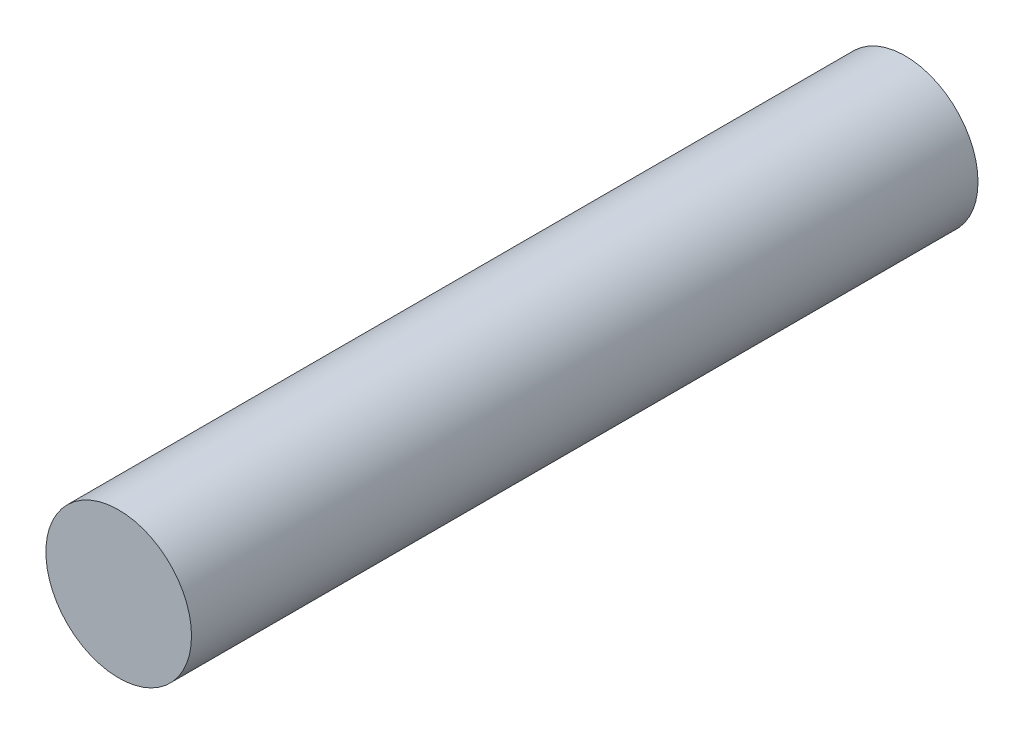
ISO-10303-21;
HEADER;
FILE_DESCRIPTION(('STEP AP214'),'2;1');
FILE_NAME('part.step','',(''),(''),'','','');
FILE_SCHEMA(('AUTOMOTIVE_DESIGN { 1 0 10303 214 1 1 1 1 }'));
ENDSEC;
DATA;
#1=APPLICATION_CONTEXT('core data for automotive mechanical design processes');
#2=APPLICATION_PROTOCOL_DEFINITION('international standard','automotive_design',2000,#1);
#3=PRODUCT_CONTEXT('',#1,'mechanical');
#4=PRODUCT('Part','Part','',(#3));
#5=PRODUCT_RELATED_PRODUCT_CATEGORY('part','',(#4));
#6=PRODUCT_DEFINITION_FORMATION('','',#4);
#7=PRODUCT_DEFINITION_CONTEXT('part definition',#1,'design');
#8=PRODUCT_DEFINITION('design','',#6,#7);
#9=PRODUCT_DEFINITION_SHAPE('','',#8);
#10=(LENGTH_UNIT() NAMED_UNIT(*) SI_UNIT(.MILLI.,.METRE.));
#11=(NAMED_UNIT(*) PLANE_ANGLE_UNIT() SI_UNIT($,.RADIAN.));
#12=(NAMED_UNIT(*) SI_UNIT($,.STERADIAN.) SOLID_ANGLE_UNIT());
#13=UNCERTAINTY_MEASURE_WITH_UNIT(LENGTH_MEASURE(1.E-05),#10,'distance_accuracy_value','');
#14=(GEOMETRIC_REPRESENTATION_CONTEXT(3) GLOBAL_UNCERTAINTY_ASSIGNED_CONTEXT((#13)) GLOBAL_UNIT_ASSIGNED_CONTEXT((#10,
#11,#12)) REPRESENTATION_CONTEXT('',''));
#15=CARTESIAN_POINT('',(0.,0.,0.));
#16=DIRECTION('',(0.,0.,1.));
#17=DIRECTION('',(1.,0.,0.));
#18=AXIS2_PLACEMENT_3D('',#15,#16,#17);
#19=CARTESIAN_POINT('',(0.,0.,27.));
#20=DIRECTION('',(0.,0.,-1.));
#21=DIRECTION('',(-1.,0.,0.));
#22=AXIS2_PLACEMENT_3D('',#19,#20,#21);
#23=CYLINDRICAL_SURFACE('',#22,2.5);
#24=CARTESIAN_POINT('',(0.,0.,27.));
#25=DIRECTION('',(0.,0.,1.));
#26=DIRECTION('',(1.,0.,0.));
#27=AXIS2_PLACEMENT_3D('',#24,#25,#26);
#28=CIRCLE('',#27,2.5);
#29=CARTESIAN_POINT('',(2.5,0.,27.));
#30=VERTEX_POINT('',#29);
#31=EDGE_CURVE('E10',#30,#30,#28,.T.);
#32=ORIENTED_EDGE('',*,*,#31,.F.);
#33=EDGE_LOOP('',(#32));
#34=FACE_BOUND('',#33,.T.);
#35=CARTESIAN_POINT('',(0.,0.,0.));
#36=DIRECTION('',(0.,0.,1.));
#37=DIRECTION('',(1.,0.,0.));
#38=AXIS2_PLACEMENT_3D('',#35,#36,#37);
#39=CIRCLE('',#38,2.5);
#40=CARTESIAN_POINT('',(2.5,0.,0.));
#41=VERTEX_POINT('',#40);
#42=EDGE_CURVE('E44',#41,#41,#39,.T.);
#43=ORIENTED_EDGE('',*,*,#42,.T.);
#44=EDGE_LOOP('',(#43));
#45=FACE_BOUND('',#44,.T.);
#46=ADVANCED_FACE('F41',(#34,#45),#23,.T.);
#47=CARTESIAN_POINT('',(0.,0.,27.));
#48=DIRECTION('',(0.,0.,1.));
#49=DIRECTION('',(1.,0.,0.));
#50=AXIS2_PLACEMENT_3D('',#47,#48,#49);
#51=PLANE('',#50);
#52=ORIENTED_EDGE('',*,*,#31,.T.);
#53=EDGE_LOOP('',(#52));
#54=FACE_BOUND('',#53,.T.);
#55=ADVANCED_FACE('F58',(#54),#51,.T.);
#56=CARTESIAN_POINT('',(0.,0.,0.));
#57=DIRECTION('',(0.,0.,1.));
#58=DIRECTION('',(1.,0.,0.));
#59=AXIS2_PLACEMENT_3D('',#56,#57,#58);
#60=PLANE('',#59);
#61=ORIENTED_EDGE('',*,*,#42,.F.);
#62=EDGE_LOOP('',(#61));
#63=FACE_BOUND('',#62,.T.);
#64=ADVANCED_FACE('F56',(#63),#60,.F.);
#65=CLOSED_SHELL('',(#46,#55,#64));
#66=MANIFOLD_SOLID_BREP('B2',#65);
#67=ADVANCED_BREP_SHAPE_REPRESENTATION('',(#18,#66),#14);
#68=SHAPE_DEFINITION_REPRESENTATION(#9,#67);
ENDSEC;
END-ISO-10303-21;
